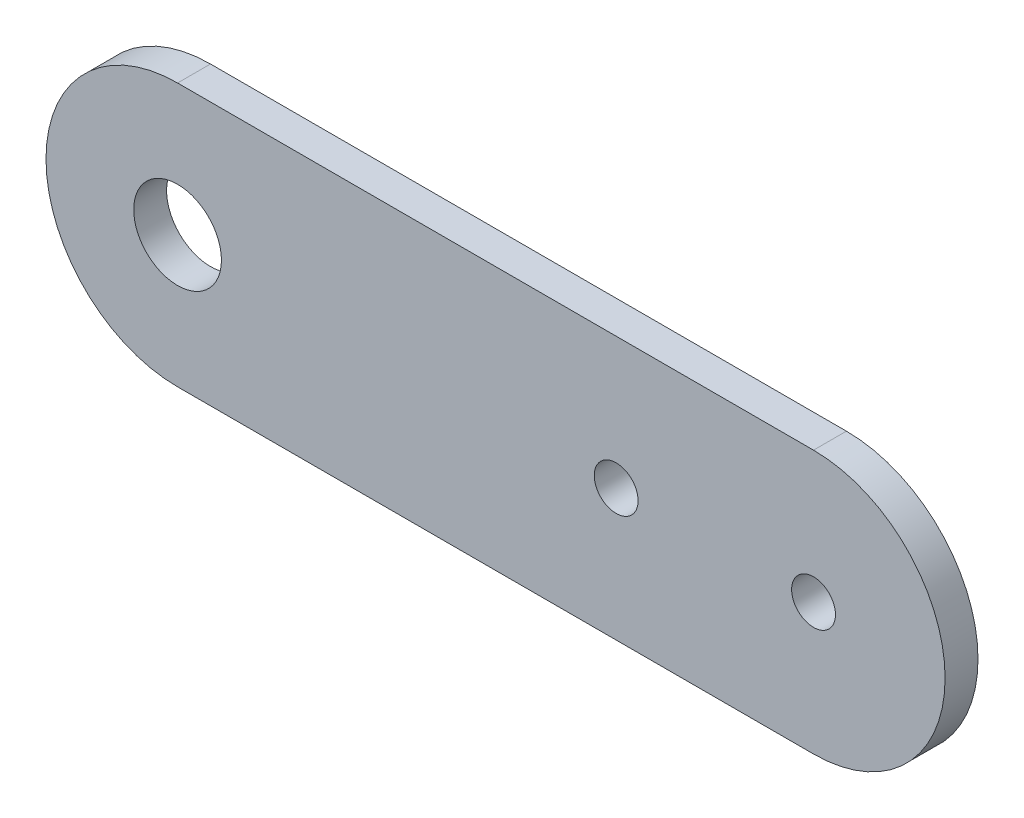
ISO-10303-21;
HEADER;
FILE_DESCRIPTION(('STEP AP214'),'2;1');
FILE_NAME('part.step','',(''),(''),'','','');
FILE_SCHEMA(('AUTOMOTIVE_DESIGN { 1 0 10303 214 1 1 1 1 }'));
ENDSEC;
DATA;
#1=APPLICATION_CONTEXT('core data for automotive mechanical design processes');
#2=APPLICATION_PROTOCOL_DEFINITION('international standard','automotive_design',2000,#1);
#3=PRODUCT_CONTEXT('',#1,'mechanical');
#4=PRODUCT('Part','Part','',(#3));
#5=PRODUCT_RELATED_PRODUCT_CATEGORY('part','',(#4));
#6=PRODUCT_DEFINITION_FORMATION('','',#4);
#7=PRODUCT_DEFINITION_CONTEXT('part definition',#1,'design');
#8=PRODUCT_DEFINITION('design','',#6,#7);
#9=PRODUCT_DEFINITION_SHAPE('','',#8);
#10=(LENGTH_UNIT() NAMED_UNIT(*) SI_UNIT(.MILLI.,.METRE.));
#11=(NAMED_UNIT(*) PLANE_ANGLE_UNIT() SI_UNIT($,.RADIAN.));
#12=(NAMED_UNIT(*) SI_UNIT($,.STERADIAN.) SOLID_ANGLE_UNIT());
#13=UNCERTAINTY_MEASURE_WITH_UNIT(LENGTH_MEASURE(1.E-05),#10,'distance_accuracy_value','');
#14=(GEOMETRIC_REPRESENTATION_CONTEXT(3) GLOBAL_UNCERTAINTY_ASSIGNED_CONTEXT((#13)) GLOBAL_UNIT_ASSIGNED_CONTEXT((#10,
#11,#12)) REPRESENTATION_CONTEXT('',''));
#15=CARTESIAN_POINT('',(0.,0.,0.));
#16=DIRECTION('',(0.,0.,1.));
#17=DIRECTION('',(1.,0.,0.));
#18=AXIS2_PLACEMENT_3D('',#15,#16,#17);
#19=CARTESIAN_POINT('',(-29.,0.,1.5));
#20=DIRECTION('',(0.,0.,1.));
#21=DIRECTION('',(1.,0.,0.));
#22=AXIS2_PLACEMENT_3D('',#19,#20,#21);
#23=PLANE('',#22);
#24=CARTESIAN_POINT('',(-9.,0.,1.5));
#25=DIRECTION('',(0.,0.,1.));
#26=DIRECTION('',(1.,0.,0.));
#27=AXIS2_PLACEMENT_3D('',#24,#25,#26);
#28=CIRCLE('',#27,1.);
#29=CARTESIAN_POINT('',(-8.,0.,1.5));
#30=VERTEX_POINT('',#29);
#31=EDGE_CURVE('E115',#30,#30,#28,.T.);
#32=ORIENTED_EDGE('',*,*,#31,.F.);
#33=EDGE_LOOP('',(#32));
#34=FACE_BOUND('',#33,.T.);
#35=CARTESIAN_POINT('',(-29.,0.,1.5));
#36=DIRECTION('',(0.,0.,1.));
#37=DIRECTION('',(1.,0.,0.));
#38=AXIS2_PLACEMENT_3D('',#35,#36,#37);
#39=CIRCLE('',#38,6.);
#40=CARTESIAN_POINT('',(-29.,6.,1.5));
#41=VERTEX_POINT('',#40);
#42=CARTESIAN_POINT('',(-29.,-6.,1.5));
#43=VERTEX_POINT('',#42);
#44=EDGE_CURVE('E85',#41,#43,#39,.T.);
#45=ORIENTED_EDGE('',*,*,#44,.T.);
#46=DIRECTION('',(1.,0.,0.));
#47=VECTOR('',#46,1.);
#48=CARTESIAN_POINT('',(0.,-6.,1.5));
#49=LINE('',#48,#47);
#50=CARTESIAN_POINT('',(0.,-6.,1.5));
#51=VERTEX_POINT('',#50);
#52=EDGE_CURVE('E80',#43,#51,#49,.T.);
#53=ORIENTED_EDGE('',*,*,#52,.T.);
#54=CARTESIAN_POINT('',(0.,0.,1.5));
#55=DIRECTION('',(0.,0.,1.));
#56=DIRECTION('',(1.,0.,0.));
#57=AXIS2_PLACEMENT_3D('',#54,#55,#56);
#58=CIRCLE('',#57,6.);
#59=CARTESIAN_POINT('',(0.,6.,1.5));
#60=VERTEX_POINT('',#59);
#61=EDGE_CURVE('E83',#51,#60,#58,.T.);
#62=ORIENTED_EDGE('',*,*,#61,.T.);
#63=DIRECTION('',(-1.,0.,0.));
#64=VECTOR('',#63,1.);
#65=CARTESIAN_POINT('',(0.,6.,1.5));
#66=LINE('',#65,#64);
#67=EDGE_CURVE('E50',#60,#41,#66,.T.);
#68=ORIENTED_EDGE('',*,*,#67,.T.);
#69=EDGE_LOOP('',(#45,#53,#62,#68));
#70=FACE_BOUND('',#69,.T.);
#71=CARTESIAN_POINT('',(0.,0.,1.5));
#72=DIRECTION('',(0.,0.,1.));
#73=DIRECTION('',(1.,0.,0.));
#74=AXIS2_PLACEMENT_3D('',#71,#72,#73);
#75=CIRCLE('',#74,1.);
#76=CARTESIAN_POINT('',(1.,0.,1.5));
#77=VERTEX_POINT('',#76);
#78=EDGE_CURVE('E100',#77,#77,#75,.T.);
#79=ORIENTED_EDGE('',*,*,#78,.F.);
#80=EDGE_LOOP('',(#79));
#81=FACE_BOUND('',#80,.T.);
#82=CARTESIAN_POINT('',(-29.,0.,1.5));
#83=DIRECTION('',(0.,0.,1.));
#84=DIRECTION('',(1.,0.,0.));
#85=AXIS2_PLACEMENT_3D('',#82,#83,#84);
#86=CIRCLE('',#85,2.);
#87=CARTESIAN_POINT('',(-27.,0.,1.5));
#88=VERTEX_POINT('',#87);
#89=EDGE_CURVE('E121',#88,#88,#86,.T.);
#90=ORIENTED_EDGE('',*,*,#89,.F.);
#91=EDGE_LOOP('',(#90));
#92=FACE_BOUND('',#91,.T.);
#93=ADVANCED_FACE('F33',(#34,#70,#81,#92),#23,.T.);
#94=CARTESIAN_POINT('',(-29.,0.,0.));
#95=DIRECTION('',(0.,0.,1.));
#96=DIRECTION('',(1.,0.,0.));
#97=AXIS2_PLACEMENT_3D('',#94,#95,#96);
#98=PLANE('',#97);
#99=CARTESIAN_POINT('',(-9.,0.,0.));
#100=DIRECTION('',(0.,0.,1.));
#101=DIRECTION('',(1.,0.,0.));
#102=AXIS2_PLACEMENT_3D('',#99,#100,#101);
#103=CIRCLE('',#102,1.);
#104=CARTESIAN_POINT('',(-8.,0.,0.));
#105=VERTEX_POINT('',#104);
#106=EDGE_CURVE('E118',#105,#105,#103,.T.);
#107=ORIENTED_EDGE('',*,*,#106,.T.);
#108=EDGE_LOOP('',(#107));
#109=FACE_BOUND('',#108,.T.);
#110=CARTESIAN_POINT('',(-29.,0.,0.));
#111=DIRECTION('',(0.,0.,1.));
#112=DIRECTION('',(1.,0.,0.));
#113=AXIS2_PLACEMENT_3D('',#110,#111,#112);
#114=CIRCLE('',#113,6.);
#115=CARTESIAN_POINT('',(-29.,6.,0.));
#116=VERTEX_POINT('',#115);
#117=CARTESIAN_POINT('',(-29.,-6.,0.));
#118=VERTEX_POINT('',#117);
#119=EDGE_CURVE('E97',#116,#118,#114,.T.);
#120=ORIENTED_EDGE('',*,*,#119,.F.);
#121=DIRECTION('',(-1.,0.,0.));
#122=VECTOR('',#121,1.);
#123=CARTESIAN_POINT('',(0.,6.,0.));
#124=LINE('',#123,#122);
#125=CARTESIAN_POINT('',(0.,6.,0.));
#126=VERTEX_POINT('',#125);
#127=EDGE_CURVE('E73',#126,#116,#124,.T.);
#128=ORIENTED_EDGE('',*,*,#127,.F.);
#129=CARTESIAN_POINT('',(0.,0.,0.));
#130=DIRECTION('',(0.,0.,1.));
#131=DIRECTION('',(1.,0.,0.));
#132=AXIS2_PLACEMENT_3D('',#129,#130,#131);
#133=CIRCLE('',#132,6.);
#134=CARTESIAN_POINT('',(0.,-6.,0.));
#135=VERTEX_POINT('',#134);
#136=EDGE_CURVE('E67',#135,#126,#133,.T.);
#137=ORIENTED_EDGE('',*,*,#136,.F.);
#138=DIRECTION('',(1.,0.,0.));
#139=VECTOR('',#138,1.);
#140=CARTESIAN_POINT('',(0.,-6.,0.));
#141=LINE('',#140,#139);
#142=EDGE_CURVE('E89',#118,#135,#141,.T.);
#143=ORIENTED_EDGE('',*,*,#142,.F.);
#144=EDGE_LOOP('',(#120,#128,#137,#143));
#145=FACE_BOUND('',#144,.T.);
#146=CARTESIAN_POINT('',(0.,0.,0.));
#147=DIRECTION('',(0.,0.,1.));
#148=DIRECTION('',(1.,0.,0.));
#149=AXIS2_PLACEMENT_3D('',#146,#147,#148);
#150=CIRCLE('',#149,1.);
#151=CARTESIAN_POINT('',(1.,0.,0.));
#152=VERTEX_POINT('',#151);
#153=EDGE_CURVE('E112',#152,#152,#150,.T.);
#154=ORIENTED_EDGE('',*,*,#153,.T.);
#155=EDGE_LOOP('',(#154));
#156=FACE_BOUND('',#155,.T.);
#157=CARTESIAN_POINT('',(-29.,0.,0.));
#158=DIRECTION('',(0.,0.,1.));
#159=DIRECTION('',(1.,0.,0.));
#160=AXIS2_PLACEMENT_3D('',#157,#158,#159);
#161=CIRCLE('',#160,2.);
#162=CARTESIAN_POINT('',(-27.,0.,0.));
#163=VERTEX_POINT('',#162);
#164=EDGE_CURVE('E124',#163,#163,#161,.T.);
#165=ORIENTED_EDGE('',*,*,#164,.T.);
#166=EDGE_LOOP('',(#165));
#167=FACE_BOUND('',#166,.T.);
#168=ADVANCED_FACE('F108',(#109,#145,#156,#167),#98,.F.);
#169=CARTESIAN_POINT('',(-29.,0.,1.5));
#170=DIRECTION('',(0.,0.,-1.));
#171=DIRECTION('',(-1.,0.,0.));
#172=AXIS2_PLACEMENT_3D('',#169,#170,#171);
#173=CYLINDRICAL_SURFACE('',#172,6.);
#174=ORIENTED_EDGE('',*,*,#119,.T.);
#175=DIRECTION('',(0.,0.,-1.));
#176=VECTOR('',#175,1.);
#177=CARTESIAN_POINT('',(-29.,-6.,1.5));
#178=LINE('',#177,#176);
#179=EDGE_CURVE('E11',#43,#118,#178,.T.);
#180=ORIENTED_EDGE('',*,*,#179,.F.);
#181=ORIENTED_EDGE('',*,*,#44,.F.);
#182=DIRECTION('',(0.,0.,-1.));
#183=VECTOR('',#182,1.);
#184=CARTESIAN_POINT('',(-29.,6.,1.5));
#185=LINE('',#184,#183);
#186=EDGE_CURVE('E93',#41,#116,#185,.T.);
#187=ORIENTED_EDGE('',*,*,#186,.T.);
#188=EDGE_LOOP('',(#174,#180,#181,#187));
#189=FACE_BOUND('',#188,.T.);
#190=ADVANCED_FACE('F35',(#189),#173,.T.);
#191=CARTESIAN_POINT('',(0.,-6.,1.5));
#192=DIRECTION('',(0.,1.,0.));
#193=DIRECTION('',(0.,0.,1.));
#194=AXIS2_PLACEMENT_3D('',#191,#192,#193);
#195=PLANE('',#194);
#196=ORIENTED_EDGE('',*,*,#142,.T.);
#197=DIRECTION('',(0.,0.,-1.));
#198=VECTOR('',#197,1.);
#199=CARTESIAN_POINT('',(0.,-6.,1.5));
#200=LINE('',#199,#198);
#201=EDGE_CURVE('E42',#51,#135,#200,.T.);
#202=ORIENTED_EDGE('',*,*,#201,.F.);
#203=ORIENTED_EDGE('',*,*,#52,.F.);
#204=ORIENTED_EDGE('',*,*,#179,.T.);
#205=EDGE_LOOP('',(#196,#202,#203,#204));
#206=FACE_BOUND('',#205,.T.);
#207=ADVANCED_FACE('F88',(#206),#195,.F.);
#208=CARTESIAN_POINT('',(0.,0.,1.5));
#209=DIRECTION('',(0.,0.,-1.));
#210=DIRECTION('',(-1.,0.,0.));
#211=AXIS2_PLACEMENT_3D('',#208,#209,#210);
#212=CYLINDRICAL_SURFACE('',#211,6.);
#213=ORIENTED_EDGE('',*,*,#136,.T.);
#214=DIRECTION('',(0.,0.,-1.));
#215=VECTOR('',#214,1.);
#216=CARTESIAN_POINT('',(0.,6.,1.5));
#217=LINE('',#216,#215);
#218=EDGE_CURVE('E90',#60,#126,#217,.T.);
#219=ORIENTED_EDGE('',*,*,#218,.F.);
#220=ORIENTED_EDGE('',*,*,#61,.F.);
#221=ORIENTED_EDGE('',*,*,#201,.T.);
#222=EDGE_LOOP('',(#213,#219,#220,#221));
#223=FACE_BOUND('',#222,.T.);
#224=ADVANCED_FACE('F91',(#223),#212,.T.);
#225=CARTESIAN_POINT('',(0.,6.,1.5));
#226=DIRECTION('',(0.,-1.,0.));
#227=DIRECTION('',(1.,0.,0.));
#228=AXIS2_PLACEMENT_3D('',#225,#226,#227);
#229=PLANE('',#228);
#230=ORIENTED_EDGE('',*,*,#127,.T.);
#231=ORIENTED_EDGE('',*,*,#186,.F.);
#232=ORIENTED_EDGE('',*,*,#67,.F.);
#233=ORIENTED_EDGE('',*,*,#218,.T.);
#234=EDGE_LOOP('',(#230,#231,#232,#233));
#235=FACE_BOUND('',#234,.T.);
#236=ADVANCED_FACE('F105',(#235),#229,.F.);
#237=CARTESIAN_POINT('',(0.,0.,1.5));
#238=DIRECTION('',(0.,0.,-1.));
#239=DIRECTION('',(-1.,0.,0.));
#240=AXIS2_PLACEMENT_3D('',#237,#238,#239);
#241=CYLINDRICAL_SURFACE('',#240,1.);
#242=ORIENTED_EDGE('',*,*,#78,.T.);
#243=EDGE_LOOP('',(#242));
#244=FACE_BOUND('',#243,.T.);
#245=ORIENTED_EDGE('',*,*,#153,.F.);
#246=EDGE_LOOP('',(#245));
#247=FACE_BOUND('',#246,.T.);
#248=ADVANCED_FACE('F143',(#244,#247),#241,.F.);
#249=CARTESIAN_POINT('',(-9.,0.,1.5));
#250=DIRECTION('',(0.,0.,-1.));
#251=DIRECTION('',(-1.,0.,0.));
#252=AXIS2_PLACEMENT_3D('',#249,#250,#251);
#253=CYLINDRICAL_SURFACE('',#252,1.);
#254=ORIENTED_EDGE('',*,*,#31,.T.);
#255=EDGE_LOOP('',(#254));
#256=FACE_BOUND('',#255,.T.);
#257=ORIENTED_EDGE('',*,*,#106,.F.);
#258=EDGE_LOOP('',(#257));
#259=FACE_BOUND('',#258,.T.);
#260=ADVANCED_FACE('F189',(#256,#259),#253,.F.);
#261=CARTESIAN_POINT('',(-29.,0.,1.5));
#262=DIRECTION('',(0.,0.,-1.));
#263=DIRECTION('',(-1.,0.,0.));
#264=AXIS2_PLACEMENT_3D('',#261,#262,#263);
#265=CYLINDRICAL_SURFACE('',#264,2.);
#266=ORIENTED_EDGE('',*,*,#89,.T.);
#267=EDGE_LOOP('',(#266));
#268=FACE_BOUND('',#267,.T.);
#269=ORIENTED_EDGE('',*,*,#164,.F.);
#270=EDGE_LOOP('',(#269));
#271=FACE_BOUND('',#270,.T.);
#272=ADVANCED_FACE('F130',(#268,#271),#265,.F.);
#273=CLOSED_SHELL('',(#93,#168,#190,#207,#224,#236,#248,#260,#272));
#274=MANIFOLD_SOLID_BREP('B2',#273);
#275=ADVANCED_BREP_SHAPE_REPRESENTATION('',(#18,#274),#14);
#276=SHAPE_DEFINITION_REPRESENTATION(#9,#275);
ENDSEC;
END-ISO-10303-21;
